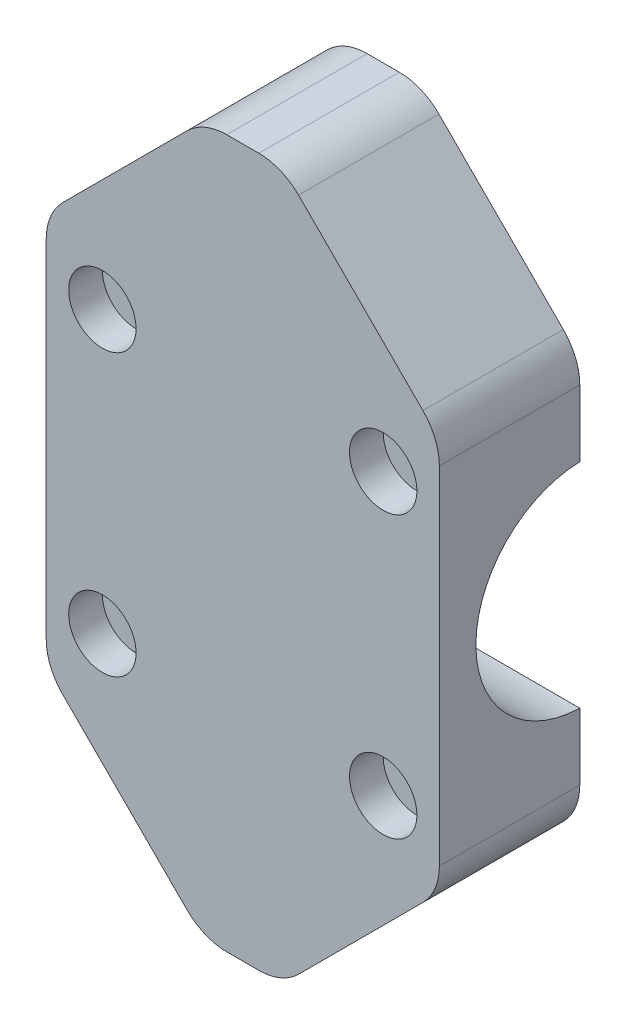
ISO-10303-21;
HEADER;
FILE_DESCRIPTION(('STEP AP214'),'2;1');
FILE_NAME('part.step','',(''),(''),'','','');
FILE_SCHEMA(('AUTOMOTIVE_DESIGN { 1 0 10303 214 1 1 1 1 }'));
ENDSEC;
DATA;
#1=APPLICATION_CONTEXT('core data for automotive mechanical design processes');
#2=APPLICATION_PROTOCOL_DEFINITION('international standard','automotive_design',2000,#1);
#3=PRODUCT_CONTEXT('',#1,'mechanical');
#4=PRODUCT('Part','Part','',(#3));
#5=PRODUCT_RELATED_PRODUCT_CATEGORY('part','',(#4));
#6=PRODUCT_DEFINITION_FORMATION('','',#4);
#7=PRODUCT_DEFINITION_CONTEXT('part definition',#1,'design');
#8=PRODUCT_DEFINITION('design','',#6,#7);
#9=PRODUCT_DEFINITION_SHAPE('','',#8);
#10=(LENGTH_UNIT() NAMED_UNIT(*) SI_UNIT(.MILLI.,.METRE.));
#11=(NAMED_UNIT(*) PLANE_ANGLE_UNIT() SI_UNIT($,.RADIAN.));
#12=(NAMED_UNIT(*) SI_UNIT($,.STERADIAN.) SOLID_ANGLE_UNIT());
#13=UNCERTAINTY_MEASURE_WITH_UNIT(LENGTH_MEASURE(1.E-05),#10,'distance_accuracy_value','');
#14=(GEOMETRIC_REPRESENTATION_CONTEXT(3) GLOBAL_UNCERTAINTY_ASSIGNED_CONTEXT((#13)) GLOBAL_UNIT_ASSIGNED_CONTEXT((#10,
#11,#12)) REPRESENTATION_CONTEXT('',''));
#15=CARTESIAN_POINT('',(0.,0.,0.));
#16=DIRECTION('',(0.,0.,1.));
#17=DIRECTION('',(1.,0.,0.));
#18=AXIS2_PLACEMENT_3D('',#15,#16,#17);
#19=CARTESIAN_POINT('',(0.,0.,-12.5));
#20=DIRECTION('',(0.,0.,-1.));
#21=DIRECTION('',(1.,0.,0.));
#22=AXIS2_PLACEMENT_3D('',#19,#20,#21);
#23=PLANE('',#22);
#24=CARTESIAN_POINT('',(-12.5,-12.5,-12.5));
#25=DIRECTION('',(0.,0.,1.));
#26=DIRECTION('',(-1.,0.,0.));
#27=AXIS2_PLACEMENT_3D('',#24,#25,#26);
#28=CIRCLE('',#27,1.75);
#29=CARTESIAN_POINT('',(-14.25,-12.5,-12.5));
#30=VERTEX_POINT('',#29);
#31=EDGE_CURVE('E368',#30,#30,#28,.T.);
#32=ORIENTED_EDGE('',*,*,#31,.T.);
#33=EDGE_LOOP('',(#32));
#34=FACE_BOUND('',#33,.T.);
#35=CARTESIAN_POINT('',(12.5,-12.5,-12.5));
#36=DIRECTION('',(0.,0.,1.));
#37=DIRECTION('',(1.,0.,0.));
#38=AXIS2_PLACEMENT_3D('',#35,#36,#37);
#39=CIRCLE('',#38,1.75);
#40=CARTESIAN_POINT('',(14.25,-12.5,-12.5));
#41=VERTEX_POINT('',#40);
#42=EDGE_CURVE('E362',#41,#41,#39,.T.);
#43=ORIENTED_EDGE('',*,*,#42,.T.);
#44=EDGE_LOOP('',(#43));
#45=FACE_BOUND('',#44,.T.);
#46=CARTESIAN_POINT('',(0.,-22.5,-12.5));
#47=DIRECTION('',(0.,0.,1.));
#48=DIRECTION('',(-1.,0.,0.));
#49=AXIS2_PLACEMENT_3D('',#46,#47,#48);
#50=CIRCLE('',#49,5.5);
#51=CARTESIAN_POINT('',(-5.5,-22.5,-12.5));
#52=VERTEX_POINT('',#51);
#53=EDGE_CURVE('E344',#52,#52,#50,.T.);
#54=ORIENTED_EDGE('',*,*,#53,.T.);
#55=EDGE_LOOP('',(#54));
#56=FACE_BOUND('',#55,.T.);
#57=DIRECTION('',(0.707106781186547,-0.707106781186547,0.));
#58=VECTOR('',#57,1.);
#59=CARTESIAN_POINT('',(-3.5,-31.5,-12.5));
#60=LINE('',#59,#58);
#61=CARTESIAN_POINT('',(-16.0355339059327,-18.9644660940673,-12.5));
#62=VERTEX_POINT('',#61);
#63=CARTESIAN_POINT('',(-4.96446609406727,-30.0355339059327,-12.5));
#64=VERTEX_POINT('',#63);
#65=EDGE_CURVE('E184',#62,#64,#60,.T.);
#66=ORIENTED_EDGE('',*,*,#65,.F.);
#67=CARTESIAN_POINT('',(-12.5,-15.4289321881345,-12.5));
#68=DIRECTION('',(0.,0.,1.));
#69=DIRECTION('',(1.,0.,0.));
#70=AXIS2_PLACEMENT_3D('',#67,#68,#69);
#71=CIRCLE('',#70,5.);
#72=CARTESIAN_POINT('',(-17.5,-15.4289321881345,-12.5));
#73=VERTEX_POINT('',#72);
#74=EDGE_CURVE('E256',#73,#62,#71,.T.);
#75=ORIENTED_EDGE('',*,*,#74,.F.);
#76=DIRECTION('',(0.,-1.,0.));
#77=VECTOR('',#76,1.);
#78=CARTESIAN_POINT('',(-17.5,17.5,-12.5));
#79=LINE('',#78,#77);
#80=CARTESIAN_POINT('',(-17.5,-9.49670995661129,-12.5));
#81=VERTEX_POINT('',#80);
#82=EDGE_CURVE('E185',#81,#73,#79,.T.);
#83=ORIENTED_EDGE('',*,*,#82,.F.);
#84=DIRECTION('',(1.,0.,0.));
#85=VECTOR('',#84,1.);
#86=CARTESIAN_POINT('',(-17.501,-9.49670995661129,-12.5));
#87=LINE('',#86,#85);
#88=CARTESIAN_POINT('',(17.5,-9.49670995661129,-12.5));
#89=VERTEX_POINT('',#88);
#90=EDGE_CURVE('E169',#81,#89,#87,.T.);
#91=ORIENTED_EDGE('',*,*,#90,.T.);
#92=DIRECTION('',(0.,1.,0.));
#93=VECTOR('',#92,1.);
#94=CARTESIAN_POINT('',(17.5,17.5,-12.5));
#95=LINE('',#94,#93);
#96=CARTESIAN_POINT('',(17.5,-15.4289321881345,-12.5));
#97=VERTEX_POINT('',#96);
#98=EDGE_CURVE('E199',#97,#89,#95,.T.);
#99=ORIENTED_EDGE('',*,*,#98,.F.);
#100=CARTESIAN_POINT('',(12.5,-15.4289321881345,-12.5));
#101=DIRECTION('',(0.,0.,1.));
#102=DIRECTION('',(1.,0.,0.));
#103=AXIS2_PLACEMENT_3D('',#100,#101,#102);
#104=CIRCLE('',#103,5.);
#105=CARTESIAN_POINT('',(16.0355339059327,-18.9644660940673,-12.5));
#106=VERTEX_POINT('',#105);
#107=EDGE_CURVE('E259',#106,#97,#104,.T.);
#108=ORIENTED_EDGE('',*,*,#107,.F.);
#109=DIRECTION('',(0.707106781186547,0.707106781186547,0.));
#110=VECTOR('',#109,1.);
#111=CARTESIAN_POINT('',(3.5,-31.5,-12.5));
#112=LINE('',#111,#110);
#113=CARTESIAN_POINT('',(4.96446609406726,-30.0355339059327,-12.5));
#114=VERTEX_POINT('',#113);
#115=EDGE_CURVE('E196',#114,#106,#112,.T.);
#116=ORIENTED_EDGE('',*,*,#115,.F.);
#117=CARTESIAN_POINT('',(1.42893218813453,-26.5,-12.5));
#118=DIRECTION('',(0.,0.,1.));
#119=DIRECTION('',(1.,0.,0.));
#120=AXIS2_PLACEMENT_3D('',#117,#118,#119);
#121=CIRCLE('',#120,5.);
#122=CARTESIAN_POINT('',(1.42893218813453,-31.5,-12.5));
#123=VERTEX_POINT('',#122);
#124=EDGE_CURVE('E262',#123,#114,#121,.T.);
#125=ORIENTED_EDGE('',*,*,#124,.F.);
#126=DIRECTION('',(1.,0.,0.));
#127=VECTOR('',#126,1.);
#128=CARTESIAN_POINT('',(3.5,-31.5,-12.5));
#129=LINE('',#128,#127);
#130=CARTESIAN_POINT('',(-1.42893218813453,-31.5,-12.5));
#131=VERTEX_POINT('',#130);
#132=EDGE_CURVE('E188',#131,#123,#129,.T.);
#133=ORIENTED_EDGE('',*,*,#132,.F.);
#134=CARTESIAN_POINT('',(-1.42893218813453,-26.5,-12.5));
#135=DIRECTION('',(0.,0.,1.));
#136=DIRECTION('',(1.,0.,0.));
#137=AXIS2_PLACEMENT_3D('',#134,#135,#136);
#138=CIRCLE('',#137,5.);
#139=EDGE_CURVE('E265',#64,#131,#138,.T.);
#140=ORIENTED_EDGE('',*,*,#139,.F.);
#141=EDGE_LOOP('',(#66,#75,#83,#91,#99,#108,#116,#125,#133,#140));
#142=FACE_BOUND('',#141,.T.);
#143=ADVANCED_FACE('F37',(#34,#45,#56,#142),#23,.T.);
#144=CARTESIAN_POINT('',(3.5,31.5,-12.5));
#145=DIRECTION('',(0.,-1.,0.));
#146=DIRECTION('',(0.,0.,1.));
#147=AXIS2_PLACEMENT_3D('',#144,#145,#146);
#148=PLANE('',#147);
#149=DIRECTION('',(-1.,0.,0.));
#150=VECTOR('',#149,1.);
#151=CARTESIAN_POINT('',(3.5,31.5,-12.5));
#152=LINE('',#151,#150);
#153=CARTESIAN_POINT('',(1.42893218813453,31.5,-12.5));
#154=VERTEX_POINT('',#153);
#155=CARTESIAN_POINT('',(-1.42893218813453,31.5,-12.5));
#156=VERTEX_POINT('',#155);
#157=EDGE_CURVE('E230',#154,#156,#152,.T.);
#158=ORIENTED_EDGE('',*,*,#157,.T.);
#159=DIRECTION('',(0.,0.,1.));
#160=VECTOR('',#159,1.);
#161=CARTESIAN_POINT('',(-1.42893218813453,31.5,-12.5));
#162=LINE('',#161,#160);
#163=CARTESIAN_POINT('',(-1.42893218813453,31.5,0.));
#164=VERTEX_POINT('',#163);
#165=EDGE_CURVE('E295',#164,#156,#162,.F.);
#166=ORIENTED_EDGE('',*,*,#165,.F.);
#167=DIRECTION('',(-1.,0.,0.));
#168=VECTOR('',#167,1.);
#169=CARTESIAN_POINT('',(3.5,31.5,0.));
#170=LINE('',#169,#168);
#171=CARTESIAN_POINT('',(1.42893218813453,31.5,0.));
#172=VERTEX_POINT('',#171);
#173=EDGE_CURVE('E206',#172,#164,#170,.T.);
#174=ORIENTED_EDGE('',*,*,#173,.F.);
#175=DIRECTION('',(0.,0.,1.));
#176=VECTOR('',#175,1.);
#177=CARTESIAN_POINT('',(1.42893218813453,31.5,-12.5));
#178=LINE('',#177,#176);
#179=EDGE_CURVE('E298',#154,#172,#178,.T.);
#180=ORIENTED_EDGE('',*,*,#179,.F.);
#181=EDGE_LOOP('',(#158,#166,#174,#180));
#182=FACE_BOUND('',#181,.T.);
#183=ADVANCED_FACE('F386',(#182),#148,.F.);
#184=CARTESIAN_POINT('',(-3.5,31.5,-12.5));
#185=DIRECTION('',(0.707106781186547,-0.707106781186547,0.));
#186=DIRECTION('',(0.707106781186547,0.707106781186548,0.));
#187=AXIS2_PLACEMENT_3D('',#184,#185,#186);
#188=PLANE('',#187);
#189=DIRECTION('',(-0.707106781186547,-0.707106781186547,0.));
#190=VECTOR('',#189,1.);
#191=CARTESIAN_POINT('',(-3.5,31.5,-12.5));
#192=LINE('',#191,#190);
#193=CARTESIAN_POINT('',(-4.96446609406727,30.0355339059327,-12.5));
#194=VERTEX_POINT('',#193);
#195=CARTESIAN_POINT('',(-16.0355339059327,18.9644660940673,-12.5));
#196=VERTEX_POINT('',#195);
#197=EDGE_CURVE('E190',#194,#196,#192,.T.);
#198=ORIENTED_EDGE('',*,*,#197,.T.);
#199=DIRECTION('',(0.,0.,1.));
#200=VECTOR('',#199,1.);
#201=CARTESIAN_POINT('',(-16.0355339059327,18.9644660940673,-12.5));
#202=LINE('',#201,#200);
#203=CARTESIAN_POINT('',(-16.0355339059327,18.9644660940673,0.));
#204=VERTEX_POINT('',#203);
#205=EDGE_CURVE('E45',#204,#196,#202,.F.);
#206=ORIENTED_EDGE('',*,*,#205,.F.);
#207=DIRECTION('',(-0.707106781186547,-0.707106781186547,0.));
#208=VECTOR('',#207,1.);
#209=CARTESIAN_POINT('',(-3.5,31.5,0.));
#210=LINE('',#209,#208);
#211=CARTESIAN_POINT('',(-4.96446609406727,30.0355339059327,0.));
#212=VERTEX_POINT('',#211);
#213=EDGE_CURVE('E209',#212,#204,#210,.T.);
#214=ORIENTED_EDGE('',*,*,#213,.F.);
#215=DIRECTION('',(0.,0.,1.));
#216=VECTOR('',#215,1.);
#217=CARTESIAN_POINT('',(-4.96446609406727,30.0355339059327,-12.5));
#218=LINE('',#217,#216);
#219=EDGE_CURVE('E11',#194,#212,#218,.T.);
#220=ORIENTED_EDGE('',*,*,#219,.F.);
#221=EDGE_LOOP('',(#198,#206,#214,#220));
#222=FACE_BOUND('',#221,.T.);
#223=ADVANCED_FACE('F305',(#222),#188,.F.);
#224=CARTESIAN_POINT('',(-17.5,17.5,-12.5));
#225=DIRECTION('',(1.,0.,0.));
#226=DIRECTION('',(0.,0.,1.));
#227=AXIS2_PLACEMENT_3D('',#224,#225,#226);
#228=PLANE('',#227);
#229=DIRECTION('',(0.,-1.,0.));
#230=VECTOR('',#229,1.);
#231=CARTESIAN_POINT('',(-17.5,17.5,0.));
#232=LINE('',#231,#230);
#233=CARTESIAN_POINT('',(-17.5,15.4289321881345,0.));
#234=VERTEX_POINT('',#233);
#235=CARTESIAN_POINT('',(-17.5,-15.4289321881345,0.));
#236=VERTEX_POINT('',#235);
#237=EDGE_CURVE('E212',#234,#236,#232,.T.);
#238=ORIENTED_EDGE('',*,*,#237,.F.);
#239=DIRECTION('',(0.,0.,1.));
#240=VECTOR('',#239,1.);
#241=CARTESIAN_POINT('',(-17.5,15.4289321881345,-12.5));
#242=LINE('',#241,#240);
#243=CARTESIAN_POINT('',(-17.5,15.4289321881345,-12.5));
#244=VERTEX_POINT('',#243);
#245=EDGE_CURVE('E183',#244,#234,#242,.T.);
#246=ORIENTED_EDGE('',*,*,#245,.F.);
#247=CARTESIAN_POINT('',(-17.5,9.49670995661129,-12.5));
#248=VERTEX_POINT('',#247);
#249=EDGE_CURVE('E163',#244,#248,#79,.T.);
#250=ORIENTED_EDGE('',*,*,#249,.T.);
#251=CARTESIAN_POINT('',(-17.5,0.,-12.75));
#252=DIRECTION('',(-1.,0.,0.));
#253=DIRECTION('',(0.,0.,1.));
#254=AXIS2_PLACEMENT_3D('',#251,#252,#253);
#255=CIRCLE('',#254,9.5);
#256=EDGE_CURVE('E173',#248,#81,#255,.F.);
#257=ORIENTED_EDGE('',*,*,#256,.T.);
#258=ORIENTED_EDGE('',*,*,#82,.T.);
#259=DIRECTION('',(0.,0.,1.));
#260=VECTOR('',#259,1.);
#261=CARTESIAN_POINT('',(-17.5,-15.4289321881345,-12.5));
#262=LINE('',#261,#260);
#263=EDGE_CURVE('E293',#236,#73,#262,.F.);
#264=ORIENTED_EDGE('',*,*,#263,.F.);
#265=EDGE_LOOP('',(#238,#246,#250,#257,#258,#264));
#266=FACE_BOUND('',#265,.T.);
#267=ADVANCED_FACE('F182',(#266),#228,.F.);
#268=CARTESIAN_POINT('',(-3.5,-31.5,-12.5));
#269=DIRECTION('',(0.707106781186547,0.707106781186547,0.));
#270=DIRECTION('',(-0.707106781186547,0.707106781186548,0.));
#271=AXIS2_PLACEMENT_3D('',#268,#269,#270);
#272=PLANE('',#271);
#273=DIRECTION('',(0.707106781186547,-0.707106781186547,0.));
#274=VECTOR('',#273,1.);
#275=CARTESIAN_POINT('',(-3.5,-31.5,0.));
#276=LINE('',#275,#274);
#277=CARTESIAN_POINT('',(-16.0355339059327,-18.9644660940673,0.));
#278=VERTEX_POINT('',#277);
#279=CARTESIAN_POINT('',(-4.96446609406727,-30.0355339059327,0.));
#280=VERTEX_POINT('',#279);
#281=EDGE_CURVE('E215',#278,#280,#276,.T.);
#282=ORIENTED_EDGE('',*,*,#281,.F.);
#283=DIRECTION('',(0.,0.,1.));
#284=VECTOR('',#283,1.);
#285=CARTESIAN_POINT('',(-16.0355339059327,-18.9644660940673,-12.5));
#286=LINE('',#285,#284);
#287=EDGE_CURVE('E251',#62,#278,#286,.T.);
#288=ORIENTED_EDGE('',*,*,#287,.F.);
#289=ORIENTED_EDGE('',*,*,#65,.T.);
#290=DIRECTION('',(0.,0.,1.));
#291=VECTOR('',#290,1.);
#292=CARTESIAN_POINT('',(-4.96446609406727,-30.0355339059327,-12.5));
#293=LINE('',#292,#291);
#294=EDGE_CURVE('E254',#280,#64,#293,.F.);
#295=ORIENTED_EDGE('',*,*,#294,.F.);
#296=EDGE_LOOP('',(#282,#288,#289,#295));
#297=FACE_BOUND('',#296,.T.);
#298=ADVANCED_FACE('F714',(#297),#272,.F.);
#299=CARTESIAN_POINT('',(3.5,-31.5,-12.5));
#300=DIRECTION('',(0.,1.,0.));
#301=DIRECTION('',(0.,0.,-1.));
#302=AXIS2_PLACEMENT_3D('',#299,#300,#301);
#303=PLANE('',#302);
#304=ORIENTED_EDGE('',*,*,#132,.T.);
#305=DIRECTION('',(0.,0.,1.));
#306=VECTOR('',#305,1.);
#307=CARTESIAN_POINT('',(1.42893218813453,-31.5,-12.5));
#308=LINE('',#307,#306);
#309=CARTESIAN_POINT('',(1.42893218813453,-31.5,0.));
#310=VERTEX_POINT('',#309);
#311=EDGE_CURVE('E205',#310,#123,#308,.F.);
#312=ORIENTED_EDGE('',*,*,#311,.F.);
#313=DIRECTION('',(1.,0.,0.));
#314=VECTOR('',#313,1.);
#315=CARTESIAN_POINT('',(3.5,-31.5,0.));
#316=LINE('',#315,#314);
#317=CARTESIAN_POINT('',(-1.42893218813453,-31.5,0.));
#318=VERTEX_POINT('',#317);
#319=EDGE_CURVE('E218',#318,#310,#316,.T.);
#320=ORIENTED_EDGE('',*,*,#319,.F.);
#321=DIRECTION('',(0.,0.,1.));
#322=VECTOR('',#321,1.);
#323=CARTESIAN_POINT('',(-1.42893218813453,-31.5,-12.5));
#324=LINE('',#323,#322);
#325=EDGE_CURVE('E232',#131,#318,#324,.T.);
#326=ORIENTED_EDGE('',*,*,#325,.F.);
#327=EDGE_LOOP('',(#304,#312,#320,#326));
#328=FACE_BOUND('',#327,.T.);
#329=ADVANCED_FACE('F709',(#328),#303,.F.);
#330=CARTESIAN_POINT('',(3.5,-31.5,-12.5));
#331=DIRECTION('',(-0.707106781186547,0.707106781186547,0.));
#332=DIRECTION('',(-0.707106781186547,-0.707106781186548,0.));
#333=AXIS2_PLACEMENT_3D('',#330,#331,#332);
#334=PLANE('',#333);
#335=ORIENTED_EDGE('',*,*,#115,.T.);
#336=DIRECTION('',(0.,0.,1.));
#337=VECTOR('',#336,1.);
#338=CARTESIAN_POINT('',(16.0355339059327,-18.9644660940673,-12.5));
#339=LINE('',#338,#337);
#340=CARTESIAN_POINT('',(16.0355339059327,-18.9644660940673,0.));
#341=VERTEX_POINT('',#340);
#342=EDGE_CURVE('E268',#341,#106,#339,.F.);
#343=ORIENTED_EDGE('',*,*,#342,.F.);
#344=DIRECTION('',(0.707106781186547,0.707106781186547,0.));
#345=VECTOR('',#344,1.);
#346=CARTESIAN_POINT('',(3.5,-31.5,0.));
#347=LINE('',#346,#345);
#348=CARTESIAN_POINT('',(4.96446609406726,-30.0355339059327,0.));
#349=VERTEX_POINT('',#348);
#350=EDGE_CURVE('E221',#349,#341,#347,.T.);
#351=ORIENTED_EDGE('',*,*,#350,.F.);
#352=DIRECTION('',(0.,0.,1.));
#353=VECTOR('',#352,1.);
#354=CARTESIAN_POINT('',(4.96446609406726,-30.0355339059327,-12.5));
#355=LINE('',#354,#353);
#356=EDGE_CURVE('E270',#114,#349,#355,.T.);
#357=ORIENTED_EDGE('',*,*,#356,.F.);
#358=EDGE_LOOP('',(#335,#343,#351,#357));
#359=FACE_BOUND('',#358,.T.);
#360=ADVANCED_FACE('F713',(#359),#334,.F.);
#361=CARTESIAN_POINT('',(17.5,17.5,-12.5));
#362=DIRECTION('',(-1.,0.,0.));
#363=DIRECTION('',(0.,0.,-1.));
#364=AXIS2_PLACEMENT_3D('',#361,#362,#363);
#365=PLANE('',#364);
#366=ORIENTED_EDGE('',*,*,#98,.T.);
#367=CARTESIAN_POINT('',(17.5,0.,-12.75));
#368=DIRECTION('',(-1.,0.,0.));
#369=DIRECTION('',(0.,0.,1.));
#370=AXIS2_PLACEMENT_3D('',#367,#368,#369);
#371=CIRCLE('',#370,9.5);
#372=CARTESIAN_POINT('',(17.5,9.49670995661129,-12.5));
#373=VERTEX_POINT('',#372);
#374=EDGE_CURVE('E170',#89,#373,#371,.T.);
#375=ORIENTED_EDGE('',*,*,#374,.T.);
#376=CARTESIAN_POINT('',(17.5,15.4289321881345,-12.5));
#377=VERTEX_POINT('',#376);
#378=EDGE_CURVE('E166',#373,#377,#95,.T.);
#379=ORIENTED_EDGE('',*,*,#378,.T.);
#380=DIRECTION('',(0.,0.,1.));
#381=VECTOR('',#380,1.);
#382=CARTESIAN_POINT('',(17.5,15.4289321881345,-12.5));
#383=LINE('',#382,#381);
#384=CARTESIAN_POINT('',(17.5,15.4289321881345,0.));
#385=VERTEX_POINT('',#384);
#386=EDGE_CURVE('E273',#385,#377,#383,.F.);
#387=ORIENTED_EDGE('',*,*,#386,.F.);
#388=DIRECTION('',(0.,1.,0.));
#389=VECTOR('',#388,1.);
#390=CARTESIAN_POINT('',(17.5,17.5,0.));
#391=LINE('',#390,#389);
#392=CARTESIAN_POINT('',(17.5,-15.4289321881345,0.));
#393=VERTEX_POINT('',#392);
#394=EDGE_CURVE('E224',#393,#385,#391,.T.);
#395=ORIENTED_EDGE('',*,*,#394,.F.);
#396=DIRECTION('',(0.,0.,1.));
#397=VECTOR('',#396,1.);
#398=CARTESIAN_POINT('',(17.5,-15.4289321881345,-12.5));
#399=LINE('',#398,#397);
#400=EDGE_CURVE('E276',#97,#393,#399,.T.);
#401=ORIENTED_EDGE('',*,*,#400,.F.);
#402=EDGE_LOOP('',(#366,#375,#379,#387,#395,#401));
#403=FACE_BOUND('',#402,.T.);
#404=ADVANCED_FACE('F405',(#403),#365,.F.);
#405=CARTESIAN_POINT('',(3.5,31.5,-12.5));
#406=DIRECTION('',(-0.707106781186547,-0.707106781186547,0.));
#407=DIRECTION('',(0.707106781186547,-0.707106781186548,0.));
#408=AXIS2_PLACEMENT_3D('',#405,#406,#407);
#409=PLANE('',#408);
#410=DIRECTION('',(-0.707106781186547,0.707106781186547,0.));
#411=VECTOR('',#410,1.);
#412=CARTESIAN_POINT('',(3.5,31.5,-12.5));
#413=LINE('',#412,#411);
#414=CARTESIAN_POINT('',(16.0355339059327,18.9644660940673,-12.5));
#415=VERTEX_POINT('',#414);
#416=CARTESIAN_POINT('',(4.96446609406726,30.0355339059327,-12.5));
#417=VERTEX_POINT('',#416);
#418=EDGE_CURVE('E202',#415,#417,#413,.T.);
#419=ORIENTED_EDGE('',*,*,#418,.T.);
#420=DIRECTION('',(0.,0.,1.));
#421=VECTOR('',#420,1.);
#422=CARTESIAN_POINT('',(4.96446609406726,30.0355339059327,-12.5));
#423=LINE('',#422,#421);
#424=CARTESIAN_POINT('',(4.96446609406726,30.0355339059327,0.));
#425=VERTEX_POINT('',#424);
#426=EDGE_CURVE('E279',#425,#417,#423,.F.);
#427=ORIENTED_EDGE('',*,*,#426,.F.);
#428=DIRECTION('',(-0.707106781186547,0.707106781186547,0.));
#429=VECTOR('',#428,1.);
#430=CARTESIAN_POINT('',(3.5,31.5,0.));
#431=LINE('',#430,#429);
#432=CARTESIAN_POINT('',(16.0355339059327,18.9644660940673,0.));
#433=VERTEX_POINT('',#432);
#434=EDGE_CURVE('E227',#433,#425,#431,.T.);
#435=ORIENTED_EDGE('',*,*,#434,.F.);
#436=DIRECTION('',(0.,0.,1.));
#437=VECTOR('',#436,1.);
#438=CARTESIAN_POINT('',(16.0355339059327,18.9644660940673,-12.5));
#439=LINE('',#438,#437);
#440=EDGE_CURVE('E282',#415,#433,#439,.T.);
#441=ORIENTED_EDGE('',*,*,#440,.F.);
#442=EDGE_LOOP('',(#419,#427,#435,#441));
#443=FACE_BOUND('',#442,.T.);
#444=ADVANCED_FACE('F398',(#443),#409,.F.);
#445=CARTESIAN_POINT('',(12.5,12.5,-12.5));
#446=DIRECTION('',(0.,0.,1.));
#447=DIRECTION('',(-1.,0.,0.));
#448=AXIS2_PLACEMENT_3D('',#445,#446,#447);
#449=CIRCLE('',#448,1.75);
#450=CARTESIAN_POINT('',(10.75,12.5,-12.5));
#451=VERTEX_POINT('',#450);
#452=EDGE_CURVE('E356',#451,#451,#449,.T.);
#453=ORIENTED_EDGE('',*,*,#452,.T.);
#454=EDGE_LOOP('',(#453));
#455=FACE_BOUND('',#454,.T.);
#456=CARTESIAN_POINT('',(-12.5,12.5,-12.5));
#457=DIRECTION('',(0.,0.,1.));
#458=DIRECTION('',(1.,0.,0.));
#459=AXIS2_PLACEMENT_3D('',#456,#457,#458);
#460=CIRCLE('',#459,1.75);
#461=CARTESIAN_POINT('',(-10.75,12.5,-12.5));
#462=VERTEX_POINT('',#461);
#463=EDGE_CURVE('E350',#462,#462,#460,.T.);
#464=ORIENTED_EDGE('',*,*,#463,.T.);
#465=EDGE_LOOP('',(#464));
#466=FACE_BOUND('',#465,.T.);
#467=CARTESIAN_POINT('',(0.,22.5,-12.5));
#468=DIRECTION('',(0.,0.,1.));
#469=DIRECTION('',(1.,0.,0.));
#470=AXIS2_PLACEMENT_3D('',#467,#468,#469);
#471=CIRCLE('',#470,5.5);
#472=CARTESIAN_POINT('',(5.5,22.5,-12.5));
#473=VERTEX_POINT('',#472);
#474=EDGE_CURVE('E338',#473,#473,#471,.T.);
#475=ORIENTED_EDGE('',*,*,#474,.T.);
#476=EDGE_LOOP('',(#475));
#477=FACE_BOUND('',#476,.T.);
#478=ORIENTED_EDGE('',*,*,#378,.F.);
#479=DIRECTION('',(1.,0.,0.));
#480=VECTOR('',#479,1.);
#481=CARTESIAN_POINT('',(-17.501,9.49670995661129,-12.5));
#482=LINE('',#481,#480);
#483=EDGE_CURVE('E159',#248,#373,#482,.T.);
#484=ORIENTED_EDGE('',*,*,#483,.F.);
#485=ORIENTED_EDGE('',*,*,#249,.F.);
#486=CARTESIAN_POINT('',(-12.5,15.4289321881345,-12.5));
#487=DIRECTION('',(0.,0.,1.));
#488=DIRECTION('',(1.,0.,0.));
#489=AXIS2_PLACEMENT_3D('',#486,#487,#488);
#490=CIRCLE('',#489,5.);
#491=EDGE_CURVE('E52',#196,#244,#490,.T.);
#492=ORIENTED_EDGE('',*,*,#491,.F.);
#493=ORIENTED_EDGE('',*,*,#197,.F.);
#494=CARTESIAN_POINT('',(-1.42893218813453,26.5,-12.5));
#495=DIRECTION('',(0.,0.,1.));
#496=DIRECTION('',(1.,0.,0.));
#497=AXIS2_PLACEMENT_3D('',#494,#495,#496);
#498=CIRCLE('',#497,5.);
#499=EDGE_CURVE('E286',#156,#194,#498,.T.);
#500=ORIENTED_EDGE('',*,*,#499,.F.);
#501=ORIENTED_EDGE('',*,*,#157,.F.);
#502=CARTESIAN_POINT('',(1.42893218813453,26.5,-12.5));
#503=DIRECTION('',(0.,0.,1.));
#504=DIRECTION('',(1.,0.,0.));
#505=AXIS2_PLACEMENT_3D('',#502,#503,#504);
#506=CIRCLE('',#505,5.);
#507=EDGE_CURVE('E288',#417,#154,#506,.T.);
#508=ORIENTED_EDGE('',*,*,#507,.F.);
#509=ORIENTED_EDGE('',*,*,#418,.F.);
#510=CARTESIAN_POINT('',(12.5,15.4289321881345,-12.5));
#511=DIRECTION('',(0.,0.,1.));
#512=DIRECTION('',(1.,0.,0.));
#513=AXIS2_PLACEMENT_3D('',#510,#511,#512);
#514=CIRCLE('',#513,5.);
#515=EDGE_CURVE('E290',#377,#415,#514,.T.);
#516=ORIENTED_EDGE('',*,*,#515,.F.);
#517=EDGE_LOOP('',(#478,#484,#485,#492,#493,#500,#501,#508,#509,#516));
#518=FACE_BOUND('',#517,.T.);
#519=ADVANCED_FACE('F161',(#455,#466,#477,#518),#23,.T.);
#520=CARTESIAN_POINT('',(0.,0.,0.));
#521=DIRECTION('',(0.,0.,-1.));
#522=DIRECTION('',(1.,0.,0.));
#523=AXIS2_PLACEMENT_3D('',#520,#521,#522);
#524=PLANE('',#523);
#525=CARTESIAN_POINT('',(12.5,-12.5,0.));
#526=DIRECTION('',(0.,0.,-1.));
#527=DIRECTION('',(1.,0.,0.));
#528=AXIS2_PLACEMENT_3D('',#525,#526,#527);
#529=CIRCLE('',#528,3.);
#530=CARTESIAN_POINT('',(15.5,-12.5,0.));
#531=VERTEX_POINT('',#530);
#532=EDGE_CURVE('E332',#531,#531,#529,.T.);
#533=ORIENTED_EDGE('',*,*,#532,.T.);
#534=EDGE_LOOP('',(#533));
#535=FACE_BOUND('',#534,.T.);
#536=CARTESIAN_POINT('',(-12.5,-12.5,0.));
#537=DIRECTION('',(0.,0.,-1.));
#538=DIRECTION('',(-1.,0.,0.));
#539=AXIS2_PLACEMENT_3D('',#536,#537,#538);
#540=CIRCLE('',#539,3.);
#541=CARTESIAN_POINT('',(-15.5,-12.5,0.));
#542=VERTEX_POINT('',#541);
#543=EDGE_CURVE('E326',#542,#542,#540,.T.);
#544=ORIENTED_EDGE('',*,*,#543,.T.);
#545=EDGE_LOOP('',(#544));
#546=FACE_BOUND('',#545,.T.);
#547=CARTESIAN_POINT('',(-12.5,12.5,0.));
#548=DIRECTION('',(0.,0.,-1.));
#549=DIRECTION('',(1.,0.,0.));
#550=AXIS2_PLACEMENT_3D('',#547,#548,#549);
#551=CIRCLE('',#550,3.);
#552=CARTESIAN_POINT('',(-9.5,12.5,0.));
#553=VERTEX_POINT('',#552);
#554=EDGE_CURVE('E320',#553,#553,#551,.T.);
#555=ORIENTED_EDGE('',*,*,#554,.T.);
#556=EDGE_LOOP('',(#555));
#557=FACE_BOUND('',#556,.T.);
#558=CARTESIAN_POINT('',(12.5,12.5,0.));
#559=DIRECTION('',(0.,0.,-1.));
#560=DIRECTION('',(-1.,0.,0.));
#561=AXIS2_PLACEMENT_3D('',#558,#559,#560);
#562=CIRCLE('',#561,3.);
#563=CARTESIAN_POINT('',(9.5,12.5,0.));
#564=VERTEX_POINT('',#563);
#565=EDGE_CURVE('E314',#564,#564,#562,.T.);
#566=ORIENTED_EDGE('',*,*,#565,.T.);
#567=EDGE_LOOP('',(#566));
#568=FACE_BOUND('',#567,.T.);
#569=ORIENTED_EDGE('',*,*,#319,.T.);
#570=CARTESIAN_POINT('',(1.42893218813453,-26.5,0.));
#571=DIRECTION('',(0.,0.,1.));
#572=DIRECTION('',(1.,0.,0.));
#573=AXIS2_PLACEMENT_3D('',#570,#571,#572);
#574=CIRCLE('',#573,5.);
#575=EDGE_CURVE('E247',#349,#310,#574,.F.);
#576=ORIENTED_EDGE('',*,*,#575,.F.);
#577=ORIENTED_EDGE('',*,*,#350,.T.);
#578=CARTESIAN_POINT('',(12.5,-15.4289321881345,0.));
#579=DIRECTION('',(0.,0.,1.));
#580=DIRECTION('',(1.,0.,0.));
#581=AXIS2_PLACEMENT_3D('',#578,#579,#580);
#582=CIRCLE('',#581,5.);
#583=EDGE_CURVE('E245',#393,#341,#582,.F.);
#584=ORIENTED_EDGE('',*,*,#583,.F.);
#585=ORIENTED_EDGE('',*,*,#394,.T.);
#586=CARTESIAN_POINT('',(12.5,15.4289321881345,0.));
#587=DIRECTION('',(0.,0.,1.));
#588=DIRECTION('',(1.,0.,0.));
#589=AXIS2_PLACEMENT_3D('',#586,#587,#588);
#590=CIRCLE('',#589,5.);
#591=EDGE_CURVE('E243',#433,#385,#590,.F.);
#592=ORIENTED_EDGE('',*,*,#591,.F.);
#593=ORIENTED_EDGE('',*,*,#434,.T.);
#594=CARTESIAN_POINT('',(1.42893218813453,26.5,0.));
#595=DIRECTION('',(0.,0.,1.));
#596=DIRECTION('',(1.,0.,0.));
#597=AXIS2_PLACEMENT_3D('',#594,#595,#596);
#598=CIRCLE('',#597,5.);
#599=EDGE_CURVE('E239',#172,#425,#598,.F.);
#600=ORIENTED_EDGE('',*,*,#599,.F.);
#601=ORIENTED_EDGE('',*,*,#173,.T.);
#602=CARTESIAN_POINT('',(-1.42893218813453,26.5,0.));
#603=DIRECTION('',(0.,0.,1.));
#604=DIRECTION('',(1.,0.,0.));
#605=AXIS2_PLACEMENT_3D('',#602,#603,#604);
#606=CIRCLE('',#605,5.);
#607=EDGE_CURVE('E237',#212,#164,#606,.F.);
#608=ORIENTED_EDGE('',*,*,#607,.F.);
#609=ORIENTED_EDGE('',*,*,#213,.T.);
#610=CARTESIAN_POINT('',(-12.5,15.4289321881345,0.));
#611=DIRECTION('',(0.,0.,1.));
#612=DIRECTION('',(1.,0.,0.));
#613=AXIS2_PLACEMENT_3D('',#610,#611,#612);
#614=CIRCLE('',#613,5.);
#615=EDGE_CURVE('E235',#234,#204,#614,.F.);
#616=ORIENTED_EDGE('',*,*,#615,.F.);
#617=ORIENTED_EDGE('',*,*,#237,.T.);
#618=CARTESIAN_POINT('',(-12.5,-15.4289321881345,0.));
#619=DIRECTION('',(0.,0.,1.));
#620=DIRECTION('',(1.,0.,0.));
#621=AXIS2_PLACEMENT_3D('',#618,#619,#620);
#622=CIRCLE('',#621,5.);
#623=EDGE_CURVE('E241',#278,#236,#622,.F.);
#624=ORIENTED_EDGE('',*,*,#623,.F.);
#625=ORIENTED_EDGE('',*,*,#281,.T.);
#626=CARTESIAN_POINT('',(-1.42893218813453,-26.5,0.));
#627=DIRECTION('',(0.,0.,1.));
#628=DIRECTION('',(1.,0.,0.));
#629=AXIS2_PLACEMENT_3D('',#626,#627,#628);
#630=CIRCLE('',#629,5.);
#631=EDGE_CURVE('E249',#318,#280,#630,.F.);
#632=ORIENTED_EDGE('',*,*,#631,.F.);
#633=EDGE_LOOP('',(#569,#576,#577,#584,#585,#592,#593,#600,#601,#608,#609,#616,#617,#624,#625,#632));
#634=FACE_BOUND('',#633,.T.);
#635=ADVANCED_FACE('F397',(#535,#546,#557,#568,#634),#524,.F.);
#636=CARTESIAN_POINT('',(-17.501,0.,-12.75));
#637=DIRECTION('',(1.,0.,0.));
#638=DIRECTION('',(0.,0.,1.));
#639=AXIS2_PLACEMENT_3D('',#636,#637,#638);
#640=CYLINDRICAL_SURFACE('',#639,9.5);
#641=ORIENTED_EDGE('',*,*,#256,.F.);
#642=ORIENTED_EDGE('',*,*,#483,.T.);
#643=ORIENTED_EDGE('',*,*,#374,.F.);
#644=ORIENTED_EDGE('',*,*,#90,.F.);
#645=EDGE_LOOP('',(#641,#642,#643,#644));
#646=FACE_BOUND('',#645,.T.);
#647=ADVANCED_FACE('F174',(#646),#640,.F.);
#648=CARTESIAN_POINT('',(12.5,12.5,-3.));
#649=DIRECTION('',(0.,0.,1.));
#650=DIRECTION('',(-1.,0.,0.));
#651=AXIS2_PLACEMENT_3D('',#648,#649,#650);
#652=CYLINDRICAL_SURFACE('',#651,3.);
#653=CARTESIAN_POINT('',(12.5,12.5,-3.));
#654=DIRECTION('',(0.,0.,-1.));
#655=DIRECTION('',(-1.,0.,0.));
#656=AXIS2_PLACEMENT_3D('',#653,#654,#655);
#657=CIRCLE('',#656,3.);
#658=CARTESIAN_POINT('',(9.5,12.5,-3.));
#659=VERTEX_POINT('',#658);
#660=EDGE_CURVE('E179',#659,#659,#657,.T.);
#661=ORIENTED_EDGE('',*,*,#660,.T.);
#662=EDGE_LOOP('',(#661));
#663=FACE_BOUND('',#662,.T.);
#664=ORIENTED_EDGE('',*,*,#565,.F.);
#665=EDGE_LOOP('',(#664));
#666=FACE_BOUND('',#665,.T.);
#667=ADVANCED_FACE('F454',(#663,#666),#652,.F.);
#668=CARTESIAN_POINT('',(12.5,12.5,-3.));
#669=DIRECTION('',(0.,0.,1.));
#670=DIRECTION('',(-1.,0.,0.));
#671=AXIS2_PLACEMENT_3D('',#668,#669,#670);
#672=PLANE('',#671);
#673=ORIENTED_EDGE('',*,*,#660,.F.);
#674=EDGE_LOOP('',(#673));
#675=FACE_BOUND('',#674,.T.);
#676=ADVANCED_FACE('F450',(#675),#672,.T.);
#677=CARTESIAN_POINT('',(-12.5,12.5,-3.));
#678=DIRECTION('',(0.,0.,1.));
#679=DIRECTION('',(-1.,0.,0.));
#680=AXIS2_PLACEMENT_3D('',#677,#678,#679);
#681=CYLINDRICAL_SURFACE('',#680,3.);
#682=CARTESIAN_POINT('',(-12.5,12.5,-3.));
#683=DIRECTION('',(0.,0.,-1.));
#684=DIRECTION('',(1.,0.,0.));
#685=AXIS2_PLACEMENT_3D('',#682,#683,#684);
#686=CIRCLE('',#685,3.);
#687=CARTESIAN_POINT('',(-9.5,12.5,-3.));
#688=VERTEX_POINT('',#687);
#689=EDGE_CURVE('E317',#688,#688,#686,.T.);
#690=ORIENTED_EDGE('',*,*,#689,.T.);
#691=EDGE_LOOP('',(#690));
#692=FACE_BOUND('',#691,.T.);
#693=ORIENTED_EDGE('',*,*,#554,.F.);
#694=EDGE_LOOP('',(#693));
#695=FACE_BOUND('',#694,.T.);
#696=ADVANCED_FACE('F446',(#692,#695),#681,.F.);
#697=CARTESIAN_POINT('',(-12.5,12.5,-3.));
#698=DIRECTION('',(0.,0.,-1.));
#699=DIRECTION('',(1.,0.,0.));
#700=AXIS2_PLACEMENT_3D('',#697,#698,#699);
#701=PLANE('',#700);
#702=ORIENTED_EDGE('',*,*,#689,.F.);
#703=EDGE_LOOP('',(#702));
#704=FACE_BOUND('',#703,.T.);
#705=ADVANCED_FACE('F442',(#704),#701,.F.);
#706=CARTESIAN_POINT('',(-12.5,-12.5,-3.));
#707=DIRECTION('',(0.,0.,1.));
#708=DIRECTION('',(-1.,0.,0.));
#709=AXIS2_PLACEMENT_3D('',#706,#707,#708);
#710=CYLINDRICAL_SURFACE('',#709,3.);
#711=CARTESIAN_POINT('',(-12.5,-12.5,-3.));
#712=DIRECTION('',(0.,0.,-1.));
#713=DIRECTION('',(-1.,0.,0.));
#714=AXIS2_PLACEMENT_3D('',#711,#712,#713);
#715=CIRCLE('',#714,3.);
#716=CARTESIAN_POINT('',(-15.5,-12.5,-3.));
#717=VERTEX_POINT('',#716);
#718=EDGE_CURVE('E323',#717,#717,#715,.T.);
#719=ORIENTED_EDGE('',*,*,#718,.T.);
#720=EDGE_LOOP('',(#719));
#721=FACE_BOUND('',#720,.T.);
#722=ORIENTED_EDGE('',*,*,#543,.F.);
#723=EDGE_LOOP('',(#722));
#724=FACE_BOUND('',#723,.T.);
#725=ADVANCED_FACE('F438',(#721,#724),#710,.F.);
#726=CARTESIAN_POINT('',(-12.5,-12.5,-3.));
#727=DIRECTION('',(0.,0.,1.));
#728=DIRECTION('',(-1.,0.,0.));
#729=AXIS2_PLACEMENT_3D('',#726,#727,#728);
#730=PLANE('',#729);
#731=ORIENTED_EDGE('',*,*,#718,.F.);
#732=EDGE_LOOP('',(#731));
#733=FACE_BOUND('',#732,.T.);
#734=ADVANCED_FACE('F434',(#733),#730,.T.);
#735=CARTESIAN_POINT('',(12.5,-12.5,-3.));
#736=DIRECTION('',(0.,0.,1.));
#737=DIRECTION('',(-1.,0.,0.));
#738=AXIS2_PLACEMENT_3D('',#735,#736,#737);
#739=CYLINDRICAL_SURFACE('',#738,3.);
#740=CARTESIAN_POINT('',(12.5,-12.5,-3.));
#741=DIRECTION('',(0.,0.,-1.));
#742=DIRECTION('',(1.,0.,0.));
#743=AXIS2_PLACEMENT_3D('',#740,#741,#742);
#744=CIRCLE('',#743,3.);
#745=CARTESIAN_POINT('',(15.5,-12.5,-3.));
#746=VERTEX_POINT('',#745);
#747=EDGE_CURVE('E329',#746,#746,#744,.T.);
#748=ORIENTED_EDGE('',*,*,#747,.T.);
#749=EDGE_LOOP('',(#748));
#750=FACE_BOUND('',#749,.T.);
#751=ORIENTED_EDGE('',*,*,#532,.F.);
#752=EDGE_LOOP('',(#751));
#753=FACE_BOUND('',#752,.T.);
#754=ADVANCED_FACE('F427',(#750,#753),#739,.F.);
#755=CARTESIAN_POINT('',(12.5,-12.5,-3.));
#756=DIRECTION('',(0.,0.,-1.));
#757=DIRECTION('',(1.,0.,0.));
#758=AXIS2_PLACEMENT_3D('',#755,#756,#757);
#759=PLANE('',#758);
#760=ORIENTED_EDGE('',*,*,#747,.F.);
#761=EDGE_LOOP('',(#760));
#762=FACE_BOUND('',#761,.T.);
#763=ADVANCED_FACE('F417',(#762),#759,.F.);
#764=CARTESIAN_POINT('',(0.,22.5,-7.5));
#765=DIRECTION('',(0.,0.,-1.));
#766=DIRECTION('',(1.,0.,0.));
#767=AXIS2_PLACEMENT_3D('',#764,#765,#766);
#768=CYLINDRICAL_SURFACE('',#767,5.5);
#769=CARTESIAN_POINT('',(0.,22.5,-7.5));
#770=DIRECTION('',(0.,0.,1.));
#771=DIRECTION('',(1.,0.,0.));
#772=AXIS2_PLACEMENT_3D('',#769,#770,#771);
#773=CIRCLE('',#772,5.5);
#774=CARTESIAN_POINT('',(5.5,22.5,-7.5));
#775=VERTEX_POINT('',#774);
#776=EDGE_CURVE('E335',#775,#775,#773,.T.);
#777=ORIENTED_EDGE('',*,*,#776,.T.);
#778=EDGE_LOOP('',(#777));
#779=FACE_BOUND('',#778,.T.);
#780=ORIENTED_EDGE('',*,*,#474,.F.);
#781=EDGE_LOOP('',(#780));
#782=FACE_BOUND('',#781,.T.);
#783=ADVANCED_FACE('F414',(#779,#782),#768,.F.);
#784=CARTESIAN_POINT('',(0.,22.5,-7.5));
#785=DIRECTION('',(0.,0.,-1.));
#786=DIRECTION('',(1.,0.,0.));
#787=AXIS2_PLACEMENT_3D('',#784,#785,#786);
#788=PLANE('',#787);
#789=ORIENTED_EDGE('',*,*,#776,.F.);
#790=EDGE_LOOP('',(#789));
#791=FACE_BOUND('',#790,.T.);
#792=ADVANCED_FACE('F416',(#791),#788,.T.);
#793=CARTESIAN_POINT('',(0.,-22.5,-7.5));
#794=DIRECTION('',(0.,0.,-1.));
#795=DIRECTION('',(1.,0.,0.));
#796=AXIS2_PLACEMENT_3D('',#793,#794,#795);
#797=CYLINDRICAL_SURFACE('',#796,5.5);
#798=CARTESIAN_POINT('',(0.,-22.5,-7.5));
#799=DIRECTION('',(0.,0.,1.));
#800=DIRECTION('',(-1.,0.,0.));
#801=AXIS2_PLACEMENT_3D('',#798,#799,#800);
#802=CIRCLE('',#801,5.5);
#803=CARTESIAN_POINT('',(-5.5,-22.5,-7.5));
#804=VERTEX_POINT('',#803);
#805=EDGE_CURVE('E341',#804,#804,#802,.T.);
#806=ORIENTED_EDGE('',*,*,#805,.T.);
#807=EDGE_LOOP('',(#806));
#808=FACE_BOUND('',#807,.T.);
#809=ORIENTED_EDGE('',*,*,#53,.F.);
#810=EDGE_LOOP('',(#809));
#811=FACE_BOUND('',#810,.T.);
#812=ADVANCED_FACE('F424',(#808,#811),#797,.F.);
#813=CARTESIAN_POINT('',(0.,-22.5,-7.5));
#814=DIRECTION('',(0.,0.,1.));
#815=DIRECTION('',(-1.,0.,0.));
#816=AXIS2_PLACEMENT_3D('',#813,#814,#815);
#817=PLANE('',#816);
#818=ORIENTED_EDGE('',*,*,#805,.F.);
#819=EDGE_LOOP('',(#818));
#820=FACE_BOUND('',#819,.T.);
#821=ADVANCED_FACE('F673',(#820),#817,.F.);
#822=CARTESIAN_POINT('',(-1.42893218813453,-26.5,-12.5));
#823=DIRECTION('',(0.,0.,1.));
#824=DIRECTION('',(-1.,0.,0.));
#825=AXIS2_PLACEMENT_3D('',#822,#823,#824);
#826=CYLINDRICAL_SURFACE('',#825,5.);
#827=ORIENTED_EDGE('',*,*,#139,.T.);
#828=ORIENTED_EDGE('',*,*,#325,.T.);
#829=ORIENTED_EDGE('',*,*,#631,.T.);
#830=ORIENTED_EDGE('',*,*,#294,.T.);
#831=EDGE_LOOP('',(#827,#828,#829,#830));
#832=FACE_BOUND('',#831,.T.);
#833=ADVANCED_FACE('F664',(#832),#826,.T.);
#834=CARTESIAN_POINT('',(1.42893218813453,-26.5,-12.5));
#835=DIRECTION('',(0.,0.,1.));
#836=DIRECTION('',(-1.,0.,0.));
#837=AXIS2_PLACEMENT_3D('',#834,#835,#836);
#838=CYLINDRICAL_SURFACE('',#837,5.);
#839=ORIENTED_EDGE('',*,*,#124,.T.);
#840=ORIENTED_EDGE('',*,*,#356,.T.);
#841=ORIENTED_EDGE('',*,*,#575,.T.);
#842=ORIENTED_EDGE('',*,*,#311,.T.);
#843=EDGE_LOOP('',(#839,#840,#841,#842));
#844=FACE_BOUND('',#843,.T.);
#845=ADVANCED_FACE('F655',(#844),#838,.T.);
#846=CARTESIAN_POINT('',(12.5,-15.4289321881345,-12.5));
#847=DIRECTION('',(0.,0.,1.));
#848=DIRECTION('',(-1.,0.,0.));
#849=AXIS2_PLACEMENT_3D('',#846,#847,#848);
#850=CYLINDRICAL_SURFACE('',#849,5.);
#851=ORIENTED_EDGE('',*,*,#107,.T.);
#852=ORIENTED_EDGE('',*,*,#400,.T.);
#853=ORIENTED_EDGE('',*,*,#583,.T.);
#854=ORIENTED_EDGE('',*,*,#342,.T.);
#855=EDGE_LOOP('',(#851,#852,#853,#854));
#856=FACE_BOUND('',#855,.T.);
#857=ADVANCED_FACE('F646',(#856),#850,.T.);
#858=CARTESIAN_POINT('',(12.5,15.4289321881345,-12.5));
#859=DIRECTION('',(0.,0.,1.));
#860=DIRECTION('',(-1.,0.,0.));
#861=AXIS2_PLACEMENT_3D('',#858,#859,#860);
#862=CYLINDRICAL_SURFACE('',#861,5.);
#863=ORIENTED_EDGE('',*,*,#515,.T.);
#864=ORIENTED_EDGE('',*,*,#440,.T.);
#865=ORIENTED_EDGE('',*,*,#591,.T.);
#866=ORIENTED_EDGE('',*,*,#386,.T.);
#867=EDGE_LOOP('',(#863,#864,#865,#866));
#868=FACE_BOUND('',#867,.T.);
#869=ADVANCED_FACE('F637',(#868),#862,.T.);
#870=CARTESIAN_POINT('',(-12.5,-15.4289321881345,-12.5));
#871=DIRECTION('',(0.,0.,1.));
#872=DIRECTION('',(-1.,0.,0.));
#873=AXIS2_PLACEMENT_3D('',#870,#871,#872);
#874=CYLINDRICAL_SURFACE('',#873,5.);
#875=ORIENTED_EDGE('',*,*,#74,.T.);
#876=ORIENTED_EDGE('',*,*,#287,.T.);
#877=ORIENTED_EDGE('',*,*,#623,.T.);
#878=ORIENTED_EDGE('',*,*,#263,.T.);
#879=EDGE_LOOP('',(#875,#876,#877,#878));
#880=FACE_BOUND('',#879,.T.);
#881=ADVANCED_FACE('F628',(#880),#874,.T.);
#882=CARTESIAN_POINT('',(1.42893218813453,26.5,-12.5));
#883=DIRECTION('',(0.,0.,1.));
#884=DIRECTION('',(-1.,0.,0.));
#885=AXIS2_PLACEMENT_3D('',#882,#883,#884);
#886=CYLINDRICAL_SURFACE('',#885,5.);
#887=ORIENTED_EDGE('',*,*,#507,.T.);
#888=ORIENTED_EDGE('',*,*,#179,.T.);
#889=ORIENTED_EDGE('',*,*,#599,.T.);
#890=ORIENTED_EDGE('',*,*,#426,.T.);
#891=EDGE_LOOP('',(#887,#888,#889,#890));
#892=FACE_BOUND('',#891,.T.);
#893=ADVANCED_FACE('F620',(#892),#886,.T.);
#894=CARTESIAN_POINT('',(-1.42893218813453,26.5,-12.5));
#895=DIRECTION('',(0.,0.,1.));
#896=DIRECTION('',(-1.,0.,0.));
#897=AXIS2_PLACEMENT_3D('',#894,#895,#896);
#898=CYLINDRICAL_SURFACE('',#897,5.);
#899=ORIENTED_EDGE('',*,*,#499,.T.);
#900=ORIENTED_EDGE('',*,*,#219,.T.);
#901=ORIENTED_EDGE('',*,*,#607,.T.);
#902=ORIENTED_EDGE('',*,*,#165,.T.);
#903=EDGE_LOOP('',(#899,#900,#901,#902));
#904=FACE_BOUND('',#903,.T.);
#905=ADVANCED_FACE('F613',(#904),#898,.T.);
#906=CARTESIAN_POINT('',(-12.5,15.4289321881345,-12.5));
#907=DIRECTION('',(0.,0.,1.));
#908=DIRECTION('',(-1.,0.,0.));
#909=AXIS2_PLACEMENT_3D('',#906,#907,#908);
#910=CYLINDRICAL_SURFACE('',#909,5.);
#911=ORIENTED_EDGE('',*,*,#491,.T.);
#912=ORIENTED_EDGE('',*,*,#245,.T.);
#913=ORIENTED_EDGE('',*,*,#615,.T.);
#914=ORIENTED_EDGE('',*,*,#205,.T.);
#915=EDGE_LOOP('',(#911,#912,#913,#914));
#916=FACE_BOUND('',#915,.T.);
#917=ADVANCED_FACE('F39',(#916),#910,.T.);
#918=CARTESIAN_POINT('',(-12.5,12.5,-3.4));
#919=DIRECTION('',(0.,0.,-1.));
#920=DIRECTION('',(1.,0.,0.));
#921=AXIS2_PLACEMENT_3D('',#918,#919,#920);
#922=CYLINDRICAL_SURFACE('',#921,1.75);
#923=CARTESIAN_POINT('',(-12.5,12.5,-3.4));
#924=DIRECTION('',(0.,0.,1.));
#925=DIRECTION('',(1.,0.,0.));
#926=AXIS2_PLACEMENT_3D('',#923,#924,#925);
#927=CIRCLE('',#926,1.75);
#928=CARTESIAN_POINT('',(-10.75,12.5,-3.4));
#929=VERTEX_POINT('',#928);
#930=EDGE_CURVE('E347',#929,#929,#927,.T.);
#931=ORIENTED_EDGE('',*,*,#930,.T.);
#932=EDGE_LOOP('',(#931));
#933=FACE_BOUND('',#932,.T.);
#934=ORIENTED_EDGE('',*,*,#463,.F.);
#935=EDGE_LOOP('',(#934));
#936=FACE_BOUND('',#935,.T.);
#937=ADVANCED_FACE('F596',(#933,#936),#922,.F.);
#938=CARTESIAN_POINT('',(-12.5,12.5,-3.4));
#939=DIRECTION('',(0.,0.,-1.));
#940=DIRECTION('',(1.,0.,0.));
#941=AXIS2_PLACEMENT_3D('',#938,#939,#940);
#942=PLANE('',#941);
#943=ORIENTED_EDGE('',*,*,#930,.F.);
#944=EDGE_LOOP('',(#943));
#945=FACE_BOUND('',#944,.T.);
#946=ADVANCED_FACE('F587',(#945),#942,.T.);
#947=CARTESIAN_POINT('',(12.5,12.5,-3.4));
#948=DIRECTION('',(0.,0.,-1.));
#949=DIRECTION('',(1.,0.,0.));
#950=AXIS2_PLACEMENT_3D('',#947,#948,#949);
#951=CYLINDRICAL_SURFACE('',#950,1.75);
#952=CARTESIAN_POINT('',(12.5,12.5,-3.4));
#953=DIRECTION('',(0.,0.,1.));
#954=DIRECTION('',(-1.,0.,0.));
#955=AXIS2_PLACEMENT_3D('',#952,#953,#954);
#956=CIRCLE('',#955,1.75);
#957=CARTESIAN_POINT('',(10.75,12.5,-3.4));
#958=VERTEX_POINT('',#957);
#959=EDGE_CURVE('E353',#958,#958,#956,.T.);
#960=ORIENTED_EDGE('',*,*,#959,.T.);
#961=EDGE_LOOP('',(#960));
#962=FACE_BOUND('',#961,.T.);
#963=ORIENTED_EDGE('',*,*,#452,.F.);
#964=EDGE_LOOP('',(#963));
#965=FACE_BOUND('',#964,.T.);
#966=ADVANCED_FACE('F578',(#962,#965),#951,.F.);
#967=CARTESIAN_POINT('',(12.5,12.5,-3.4));
#968=DIRECTION('',(0.,0.,1.));
#969=DIRECTION('',(-1.,0.,0.));
#970=AXIS2_PLACEMENT_3D('',#967,#968,#969);
#971=PLANE('',#970);
#972=ORIENTED_EDGE('',*,*,#959,.F.);
#973=EDGE_LOOP('',(#972));
#974=FACE_BOUND('',#973,.T.);
#975=ADVANCED_FACE('F569',(#974),#971,.F.);
#976=CARTESIAN_POINT('',(12.5,-12.5,-3.4));
#977=DIRECTION('',(0.,0.,-1.));
#978=DIRECTION('',(1.,0.,0.));
#979=AXIS2_PLACEMENT_3D('',#976,#977,#978);
#980=CYLINDRICAL_SURFACE('',#979,1.75);
#981=CARTESIAN_POINT('',(12.5,-12.5,-3.4));
#982=DIRECTION('',(0.,0.,1.));
#983=DIRECTION('',(1.,0.,0.));
#984=AXIS2_PLACEMENT_3D('',#981,#982,#983);
#985=CIRCLE('',#984,1.75);
#986=CARTESIAN_POINT('',(14.25,-12.5,-3.4));
#987=VERTEX_POINT('',#986);
#988=EDGE_CURVE('E359',#987,#987,#985,.T.);
#989=ORIENTED_EDGE('',*,*,#988,.T.);
#990=EDGE_LOOP('',(#989));
#991=FACE_BOUND('',#990,.T.);
#992=ORIENTED_EDGE('',*,*,#42,.F.);
#993=EDGE_LOOP('',(#992));
#994=FACE_BOUND('',#993,.T.);
#995=ADVANCED_FACE('F559',(#991,#994),#980,.F.);
#996=CARTESIAN_POINT('',(12.5,-12.5,-3.4));
#997=DIRECTION('',(0.,0.,-1.));
#998=DIRECTION('',(1.,0.,0.));
#999=AXIS2_PLACEMENT_3D('',#996,#997,#998);
#1000=PLANE('',#999);
#1001=ORIENTED_EDGE('',*,*,#988,.F.);
#1002=EDGE_LOOP('',(#1001));
#1003=FACE_BOUND('',#1002,.T.);
#1004=ADVANCED_FACE('F383',(#1003),#1000,.T.);
#1005=CARTESIAN_POINT('',(-12.5,-12.5,-3.4));
#1006=DIRECTION('',(0.,0.,-1.));
#1007=DIRECTION('',(1.,0.,0.));
#1008=AXIS2_PLACEMENT_3D('',#1005,#1006,#1007);
#1009=CYLINDRICAL_SURFACE('',#1008,1.75);
#1010=CARTESIAN_POINT('',(-12.5,-12.5,-3.4));
#1011=DIRECTION('',(0.,0.,1.));
#1012=DIRECTION('',(-1.,0.,0.));
#1013=AXIS2_PLACEMENT_3D('',#1010,#1011,#1012);
#1014=CIRCLE('',#1013,1.75);
#1015=CARTESIAN_POINT('',(-14.25,-12.5,-3.4));
#1016=VERTEX_POINT('',#1015);
#1017=EDGE_CURVE('E365',#1016,#1016,#1014,.T.);
#1018=ORIENTED_EDGE('',*,*,#1017,.T.);
#1019=EDGE_LOOP('',(#1018));
#1020=FACE_BOUND('',#1019,.T.);
#1021=ORIENTED_EDGE('',*,*,#31,.F.);
#1022=EDGE_LOOP('',(#1021));
#1023=FACE_BOUND('',#1022,.T.);
#1024=ADVANCED_FACE('F374',(#1020,#1023),#1009,.F.);
#1025=CARTESIAN_POINT('',(-12.5,-12.5,-3.4));
#1026=DIRECTION('',(0.,0.,1.));
#1027=DIRECTION('',(-1.,0.,0.));
#1028=AXIS2_PLACEMENT_3D('',#1025,#1026,#1027);
#1029=PLANE('',#1028);
#1030=ORIENTED_EDGE('',*,*,#1017,.F.);
#1031=EDGE_LOOP('',(#1030));
#1032=FACE_BOUND('',#1031,.T.);
#1033=ADVANCED_FACE('F377',(#1032),#1029,.F.);
#1034=CLOSED_SHELL('',(#143,#183,#223,#267,#298,#329,#360,#404,#444,#519,#635,#647,#667,#676,
#696,#705,#725,#734,#754,#763,#783,#792,#812,#821,#833,#845,#857,#869,#881,#893,#905,#917,#937,
#946,#966,#975,#995,#1004,#1024,#1033));
#1035=MANIFOLD_SOLID_BREP('B2',#1034);
#1036=ADVANCED_BREP_SHAPE_REPRESENTATION('',(#18,#1035),#14);
#1037=SHAPE_DEFINITION_REPRESENTATION(#9,#1036);
ENDSEC;
END-ISO-10303-21;
